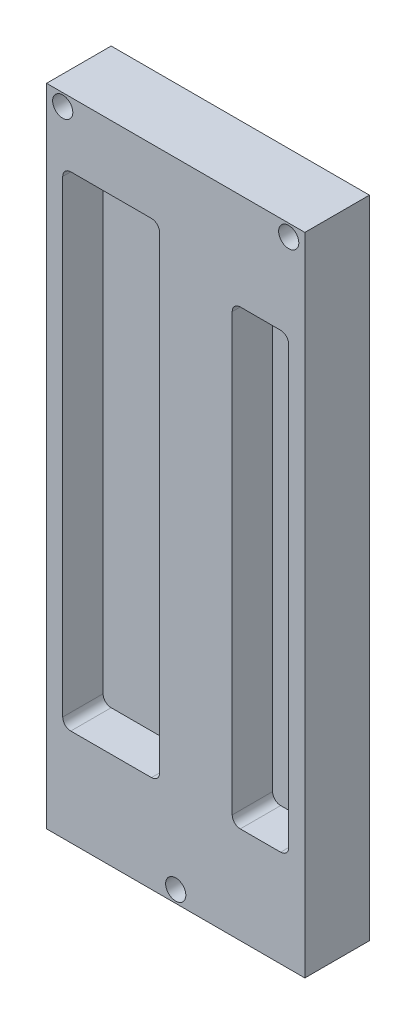
ISO-10303-21;
HEADER;
FILE_DESCRIPTION(('STEP AP214'),'2;1');
FILE_NAME('part.step','',(''),(''),'','','');
FILE_SCHEMA(('AUTOMOTIVE_DESIGN { 1 0 10303 214 1 1 1 1 }'));
ENDSEC;
DATA;
#1=APPLICATION_CONTEXT('core data for automotive mechanical design processes');
#2=APPLICATION_PROTOCOL_DEFINITION('international standard','automotive_design',2000,#1);
#3=PRODUCT_CONTEXT('',#1,'mechanical');
#4=PRODUCT('Part','Part','',(#3));
#5=PRODUCT_RELATED_PRODUCT_CATEGORY('part','',(#4));
#6=PRODUCT_DEFINITION_FORMATION('','',#4);
#7=PRODUCT_DEFINITION_CONTEXT('part definition',#1,'design');
#8=PRODUCT_DEFINITION('design','',#6,#7);
#9=PRODUCT_DEFINITION_SHAPE('','',#8);
#10=(LENGTH_UNIT() NAMED_UNIT(*) SI_UNIT(.MILLI.,.METRE.));
#11=(NAMED_UNIT(*) PLANE_ANGLE_UNIT() SI_UNIT($,.RADIAN.));
#12=(NAMED_UNIT(*) SI_UNIT($,.STERADIAN.) SOLID_ANGLE_UNIT());
#13=UNCERTAINTY_MEASURE_WITH_UNIT(LENGTH_MEASURE(1.E-05),#10,'distance_accuracy_value','');
#14=(GEOMETRIC_REPRESENTATION_CONTEXT(3) GLOBAL_UNCERTAINTY_ASSIGNED_CONTEXT((#13)) GLOBAL_UNIT_ASSIGNED_CONTEXT((#10,
#11,#12)) REPRESENTATION_CONTEXT('',''));
#15=CARTESIAN_POINT('',(0.,0.,0.));
#16=DIRECTION('',(0.,0.,1.));
#17=DIRECTION('',(1.,0.,0.));
#18=AXIS2_PLACEMENT_3D('',#15,#16,#17);
#19=CARTESIAN_POINT('',(0.,0.,8.));
#20=DIRECTION('',(0.,0.,-1.));
#21=DIRECTION('',(-1.,0.,0.));
#22=AXIS2_PLACEMENT_3D('',#19,#20,#21);
#23=PLANE('',#22);
#24=DIRECTION('',(1.,0.,0.));
#25=VECTOR('',#24,1.);
#26=CARTESIAN_POINT('',(3.00000000000001,12.,8.));
#27=LINE('',#26,#25);
#28=CARTESIAN_POINT('',(3.00000000000001,12.,8.));
#29=VERTEX_POINT('',#28);
#30=CARTESIAN_POINT('',(13.,12.,8.));
#31=VERTEX_POINT('',#30);
#32=EDGE_CURVE('E229',#29,#31,#27,.T.);
#33=ORIENTED_EDGE('',*,*,#32,.F.);
#34=CARTESIAN_POINT('',(3.00000000000001,13.,8.));
#35=DIRECTION('',(0.,0.,1.));
#36=DIRECTION('',(1.,0.,0.));
#37=AXIS2_PLACEMENT_3D('',#34,#35,#36);
#38=CIRCLE('',#37,1.);
#39=CARTESIAN_POINT('',(2.00000000000001,13.,8.));
#40=VERTEX_POINT('',#39);
#41=EDGE_CURVE('E55',#40,#29,#38,.T.);
#42=ORIENTED_EDGE('',*,*,#41,.F.);
#43=DIRECTION('',(0.,-1.,0.));
#44=VECTOR('',#43,1.);
#45=CARTESIAN_POINT('',(2.,71.,8.));
#46=LINE('',#45,#44);
#47=CARTESIAN_POINT('',(2.,71.,8.));
#48=VERTEX_POINT('',#47);
#49=EDGE_CURVE('E201',#48,#40,#46,.T.);
#50=ORIENTED_EDGE('',*,*,#49,.F.);
#51=CARTESIAN_POINT('',(3.,71.,8.));
#52=DIRECTION('',(0.,0.,1.));
#53=DIRECTION('',(1.,0.,0.));
#54=AXIS2_PLACEMENT_3D('',#51,#52,#53);
#55=CIRCLE('',#54,1.);
#56=CARTESIAN_POINT('',(3.,72.,8.));
#57=VERTEX_POINT('',#56);
#58=EDGE_CURVE('E205',#57,#48,#55,.T.);
#59=ORIENTED_EDGE('',*,*,#58,.F.);
#60=DIRECTION('',(-1.,0.,0.));
#61=VECTOR('',#60,1.);
#62=CARTESIAN_POINT('',(3.,72.,8.));
#63=LINE('',#62,#61);
#64=CARTESIAN_POINT('',(13.,72.,8.));
#65=VERTEX_POINT('',#64);
#66=EDGE_CURVE('E245',#65,#57,#63,.T.);
#67=ORIENTED_EDGE('',*,*,#66,.F.);
#68=CARTESIAN_POINT('',(13.,71.,8.));
#69=DIRECTION('',(0.,0.,1.));
#70=DIRECTION('',(-1.,0.,0.));
#71=AXIS2_PLACEMENT_3D('',#68,#69,#70);
#72=CIRCLE('',#71,1.);
#73=CARTESIAN_POINT('',(14.,71.,8.));
#74=VERTEX_POINT('',#73);
#75=EDGE_CURVE('E241',#74,#65,#72,.T.);
#76=ORIENTED_EDGE('',*,*,#75,.F.);
#77=DIRECTION('',(0.,1.,0.));
#78=VECTOR('',#77,1.);
#79=CARTESIAN_POINT('',(14.,71.,8.));
#80=LINE('',#79,#78);
#81=CARTESIAN_POINT('',(14.,13.,8.));
#82=VERTEX_POINT('',#81);
#83=EDGE_CURVE('E237',#82,#74,#80,.T.);
#84=ORIENTED_EDGE('',*,*,#83,.F.);
#85=CARTESIAN_POINT('',(13.,13.,8.));
#86=DIRECTION('',(0.,0.,1.));
#87=DIRECTION('',(1.,0.,0.));
#88=AXIS2_PLACEMENT_3D('',#85,#86,#87);
#89=CIRCLE('',#88,1.);
#90=EDGE_CURVE('E233',#31,#82,#89,.T.);
#91=ORIENTED_EDGE('',*,*,#90,.F.);
#92=EDGE_LOOP('',(#33,#42,#50,#59,#67,#76,#84,#91));
#93=FACE_BOUND('',#92,.T.);
#94=DIRECTION('',(1.,0.,0.));
#95=VECTOR('',#94,1.);
#96=CARTESIAN_POINT('',(24.,12.,8.));
#97=LINE('',#96,#95);
#98=CARTESIAN_POINT('',(24.,12.,8.));
#99=VERTEX_POINT('',#98);
#100=CARTESIAN_POINT('',(29.,12.,8.));
#101=VERTEX_POINT('',#100);
#102=EDGE_CURVE('E309',#99,#101,#97,.T.);
#103=ORIENTED_EDGE('',*,*,#102,.F.);
#104=CARTESIAN_POINT('',(24.,13.,8.));
#105=DIRECTION('',(0.,0.,1.));
#106=DIRECTION('',(1.,0.,0.));
#107=AXIS2_PLACEMENT_3D('',#104,#105,#106);
#108=CIRCLE('',#107,1.);
#109=CARTESIAN_POINT('',(23.,13.,8.));
#110=VERTEX_POINT('',#109);
#111=EDGE_CURVE('E63',#110,#99,#108,.T.);
#112=ORIENTED_EDGE('',*,*,#111,.F.);
#113=DIRECTION('',(0.,-1.,0.));
#114=VECTOR('',#113,1.);
#115=CARTESIAN_POINT('',(23.,67.,8.));
#116=LINE('',#115,#114);
#117=CARTESIAN_POINT('',(23.,67.,8.));
#118=VERTEX_POINT('',#117);
#119=EDGE_CURVE('E278',#118,#110,#116,.T.);
#120=ORIENTED_EDGE('',*,*,#119,.F.);
#121=CARTESIAN_POINT('',(24.,67.,8.));
#122=DIRECTION('',(0.,0.,1.));
#123=DIRECTION('',(1.,0.,0.));
#124=AXIS2_PLACEMENT_3D('',#121,#122,#123);
#125=CIRCLE('',#124,1.00000000000001);
#126=CARTESIAN_POINT('',(24.,68.,8.));
#127=VERTEX_POINT('',#126);
#128=EDGE_CURVE('E329',#127,#118,#125,.T.);
#129=ORIENTED_EDGE('',*,*,#128,.F.);
#130=DIRECTION('',(-1.,0.,0.));
#131=VECTOR('',#130,1.);
#132=CARTESIAN_POINT('',(24.,68.,8.));
#133=LINE('',#132,#131);
#134=CARTESIAN_POINT('',(29.,68.,8.));
#135=VERTEX_POINT('',#134);
#136=EDGE_CURVE('E325',#135,#127,#133,.T.);
#137=ORIENTED_EDGE('',*,*,#136,.F.);
#138=CARTESIAN_POINT('',(29.,67.,8.));
#139=DIRECTION('',(0.,0.,1.));
#140=DIRECTION('',(-1.,0.,0.));
#141=AXIS2_PLACEMENT_3D('',#138,#139,#140);
#142=CIRCLE('',#141,1.00000000000001);
#143=CARTESIAN_POINT('',(30.,67.,8.));
#144=VERTEX_POINT('',#143);
#145=EDGE_CURVE('E321',#144,#135,#142,.T.);
#146=ORIENTED_EDGE('',*,*,#145,.F.);
#147=DIRECTION('',(0.,1.,0.));
#148=VECTOR('',#147,1.);
#149=CARTESIAN_POINT('',(30.,67.,8.));
#150=LINE('',#149,#148);
#151=CARTESIAN_POINT('',(30.,13.,8.));
#152=VERTEX_POINT('',#151);
#153=EDGE_CURVE('E317',#152,#144,#150,.T.);
#154=ORIENTED_EDGE('',*,*,#153,.F.);
#155=CARTESIAN_POINT('',(29.,13.,8.));
#156=DIRECTION('',(0.,0.,1.));
#157=DIRECTION('',(1.,0.,0.));
#158=AXIS2_PLACEMENT_3D('',#155,#156,#157);
#159=CIRCLE('',#158,1.);
#160=EDGE_CURVE('E313',#101,#152,#159,.T.);
#161=ORIENTED_EDGE('',*,*,#160,.F.);
#162=EDGE_LOOP('',(#103,#112,#120,#129,#137,#146,#154,#161));
#163=FACE_BOUND('',#162,.T.);
#164=DIRECTION('',(0.,-1.,0.));
#165=VECTOR('',#164,1.);
#166=CARTESIAN_POINT('',(0.,0.,8.));
#167=LINE('',#166,#165);
#168=CARTESIAN_POINT('',(0.,80.,8.));
#169=VERTEX_POINT('',#168);
#170=CARTESIAN_POINT('',(0.,0.,8.));
#171=VERTEX_POINT('',#170);
#172=EDGE_CURVE('E382',#169,#171,#167,.T.);
#173=ORIENTED_EDGE('',*,*,#172,.T.);
#174=DIRECTION('',(1.,0.,0.));
#175=VECTOR('',#174,1.);
#176=CARTESIAN_POINT('',(0.,0.,8.));
#177=LINE('',#176,#175);
#178=CARTESIAN_POINT('',(32.,0.,8.));
#179=VERTEX_POINT('',#178);
#180=EDGE_CURVE('E386',#171,#179,#177,.T.);
#181=ORIENTED_EDGE('',*,*,#180,.T.);
#182=DIRECTION('',(0.,1.,0.));
#183=VECTOR('',#182,1.);
#184=CARTESIAN_POINT('',(32.,0.,8.));
#185=LINE('',#184,#183);
#186=CARTESIAN_POINT('',(32.,80.,8.));
#187=VERTEX_POINT('',#186);
#188=EDGE_CURVE('E390',#179,#187,#185,.T.);
#189=ORIENTED_EDGE('',*,*,#188,.T.);
#190=DIRECTION('',(-1.,0.,0.));
#191=VECTOR('',#190,1.);
#192=CARTESIAN_POINT('',(0.,80.,8.));
#193=LINE('',#192,#191);
#194=EDGE_CURVE('E393',#187,#169,#193,.T.);
#195=ORIENTED_EDGE('',*,*,#194,.T.);
#196=EDGE_LOOP('',(#173,#181,#189,#195));
#197=FACE_BOUND('',#196,.T.);
#198=CARTESIAN_POINT('',(2.,78.5,8.));
#199=DIRECTION('',(0.,0.,1.));
#200=DIRECTION('',(1.,0.,0.));
#201=AXIS2_PLACEMENT_3D('',#198,#199,#200);
#202=CIRCLE('',#201,1.25);
#203=CARTESIAN_POINT('',(3.25,78.5,8.));
#204=VERTEX_POINT('',#203);
#205=EDGE_CURVE('E374',#204,#204,#202,.T.);
#206=ORIENTED_EDGE('',*,*,#205,.F.);
#207=EDGE_LOOP('',(#206));
#208=FACE_BOUND('',#207,.T.);
#209=CARTESIAN_POINT('',(30.,78.5,8.));
#210=DIRECTION('',(0.,0.,1.));
#211=DIRECTION('',(1.,0.,0.));
#212=AXIS2_PLACEMENT_3D('',#209,#210,#211);
#213=CIRCLE('',#212,1.25);
#214=CARTESIAN_POINT('',(31.25,78.5,8.));
#215=VERTEX_POINT('',#214);
#216=EDGE_CURVE('E366',#215,#215,#213,.T.);
#217=ORIENTED_EDGE('',*,*,#216,.F.);
#218=EDGE_LOOP('',(#217));
#219=FACE_BOUND('',#218,.T.);
#220=CARTESIAN_POINT('',(16.,1.5,8.));
#221=DIRECTION('',(0.,0.,1.));
#222=DIRECTION('',(1.,0.,0.));
#223=AXIS2_PLACEMENT_3D('',#220,#221,#222);
#224=CIRCLE('',#223,1.25);
#225=CARTESIAN_POINT('',(17.25,1.5,8.));
#226=VERTEX_POINT('',#225);
#227=EDGE_CURVE('E358',#226,#226,#224,.T.);
#228=ORIENTED_EDGE('',*,*,#227,.F.);
#229=EDGE_LOOP('',(#228));
#230=FACE_BOUND('',#229,.T.);
#231=ADVANCED_FACE('F39',(#93,#163,#197,#208,#219,#230),#23,.F.);
#232=CARTESIAN_POINT('',(0.,0.,0.));
#233=DIRECTION('',(0.,0.,-1.));
#234=DIRECTION('',(-1.,0.,0.));
#235=AXIS2_PLACEMENT_3D('',#232,#233,#234);
#236=PLANE('',#235);
#237=CARTESIAN_POINT('',(30.,78.5,0.));
#238=DIRECTION('',(0.,0.,1.));
#239=DIRECTION('',(1.,0.,0.));
#240=AXIS2_PLACEMENT_3D('',#237,#238,#239);
#241=CIRCLE('',#240,1.25);
#242=CARTESIAN_POINT('',(31.25,78.5,0.));
#243=VERTEX_POINT('',#242);
#244=EDGE_CURVE('E362',#243,#243,#241,.T.);
#245=ORIENTED_EDGE('',*,*,#244,.T.);
#246=EDGE_LOOP('',(#245));
#247=FACE_BOUND('',#246,.T.);
#248=DIRECTION('',(0.,-1.,0.));
#249=VECTOR('',#248,1.);
#250=CARTESIAN_POINT('',(0.,0.,0.));
#251=LINE('',#250,#249);
#252=CARTESIAN_POINT('',(0.,80.,0.));
#253=VERTEX_POINT('',#252);
#254=CARTESIAN_POINT('',(0.,0.,0.));
#255=VERTEX_POINT('',#254);
#256=EDGE_CURVE('E378',#253,#255,#251,.T.);
#257=ORIENTED_EDGE('',*,*,#256,.F.);
#258=DIRECTION('',(-1.,0.,0.));
#259=VECTOR('',#258,1.);
#260=CARTESIAN_POINT('',(0.,80.,0.));
#261=LINE('',#260,#259);
#262=CARTESIAN_POINT('',(32.,80.,0.));
#263=VERTEX_POINT('',#262);
#264=EDGE_CURVE('E387',#263,#253,#261,.T.);
#265=ORIENTED_EDGE('',*,*,#264,.F.);
#266=DIRECTION('',(0.,1.,0.));
#267=VECTOR('',#266,1.);
#268=CARTESIAN_POINT('',(32.,0.,0.));
#269=LINE('',#268,#267);
#270=CARTESIAN_POINT('',(32.,0.,0.));
#271=VERTEX_POINT('',#270);
#272=EDGE_CURVE('E403',#271,#263,#269,.T.);
#273=ORIENTED_EDGE('',*,*,#272,.F.);
#274=DIRECTION('',(1.,0.,0.));
#275=VECTOR('',#274,1.);
#276=CARTESIAN_POINT('',(0.,0.,0.));
#277=LINE('',#276,#275);
#278=EDGE_CURVE('E400',#255,#271,#277,.T.);
#279=ORIENTED_EDGE('',*,*,#278,.F.);
#280=EDGE_LOOP('',(#257,#265,#273,#279));
#281=FACE_BOUND('',#280,.T.);
#282=CARTESIAN_POINT('',(2.,78.5,0.));
#283=DIRECTION('',(0.,0.,1.));
#284=DIRECTION('',(1.,0.,0.));
#285=AXIS2_PLACEMENT_3D('',#282,#283,#284);
#286=CIRCLE('',#285,1.25);
#287=CARTESIAN_POINT('',(3.25,78.5,0.));
#288=VERTEX_POINT('',#287);
#289=EDGE_CURVE('E370',#288,#288,#286,.T.);
#290=ORIENTED_EDGE('',*,*,#289,.T.);
#291=EDGE_LOOP('',(#290));
#292=FACE_BOUND('',#291,.T.);
#293=CARTESIAN_POINT('',(16.,1.5,0.));
#294=DIRECTION('',(0.,0.,1.));
#295=DIRECTION('',(1.,0.,0.));
#296=AXIS2_PLACEMENT_3D('',#293,#294,#295);
#297=CIRCLE('',#296,1.25);
#298=CARTESIAN_POINT('',(17.25,1.5,0.));
#299=VERTEX_POINT('',#298);
#300=EDGE_CURVE('E255',#299,#299,#297,.T.);
#301=ORIENTED_EDGE('',*,*,#300,.T.);
#302=EDGE_LOOP('',(#301));
#303=FACE_BOUND('',#302,.T.);
#304=ADVANCED_FACE('F426',(#247,#281,#292,#303),#236,.T.);
#305=CARTESIAN_POINT('',(0.,0.,8.));
#306=DIRECTION('',(1.,0.,0.));
#307=DIRECTION('',(0.,0.,-1.));
#308=AXIS2_PLACEMENT_3D('',#305,#306,#307);
#309=PLANE('',#308);
#310=ORIENTED_EDGE('',*,*,#256,.T.);
#311=DIRECTION('',(0.,0.,-1.));
#312=VECTOR('',#311,1.);
#313=CARTESIAN_POINT('',(0.,0.,8.));
#314=LINE('',#313,#312);
#315=EDGE_CURVE('E11',#171,#255,#314,.T.);
#316=ORIENTED_EDGE('',*,*,#315,.F.);
#317=ORIENTED_EDGE('',*,*,#172,.F.);
#318=DIRECTION('',(0.,0.,-1.));
#319=VECTOR('',#318,1.);
#320=CARTESIAN_POINT('',(0.,80.,8.));
#321=LINE('',#320,#319);
#322=EDGE_CURVE('E396',#169,#253,#321,.T.);
#323=ORIENTED_EDGE('',*,*,#322,.T.);
#324=EDGE_LOOP('',(#310,#316,#317,#323));
#325=FACE_BOUND('',#324,.T.);
#326=ADVANCED_FACE('F41',(#325),#309,.F.);
#327=CARTESIAN_POINT('',(0.,0.,8.));
#328=DIRECTION('',(0.,1.,0.));
#329=DIRECTION('',(0.,0.,1.));
#330=AXIS2_PLACEMENT_3D('',#327,#328,#329);
#331=PLANE('',#330);
#332=ORIENTED_EDGE('',*,*,#278,.T.);
#333=DIRECTION('',(0.,0.,-1.));
#334=VECTOR('',#333,1.);
#335=CARTESIAN_POINT('',(32.,0.,8.));
#336=LINE('',#335,#334);
#337=EDGE_CURVE('E48',#179,#271,#336,.T.);
#338=ORIENTED_EDGE('',*,*,#337,.F.);
#339=ORIENTED_EDGE('',*,*,#180,.F.);
#340=ORIENTED_EDGE('',*,*,#315,.T.);
#341=EDGE_LOOP('',(#332,#338,#339,#340));
#342=FACE_BOUND('',#341,.T.);
#343=ADVANCED_FACE('F437',(#342),#331,.F.);
#344=CARTESIAN_POINT('',(32.,0.,8.));
#345=DIRECTION('',(-1.,0.,0.));
#346=DIRECTION('',(0.,0.,1.));
#347=AXIS2_PLACEMENT_3D('',#344,#345,#346);
#348=PLANE('',#347);
#349=ORIENTED_EDGE('',*,*,#272,.T.);
#350=DIRECTION('',(0.,0.,-1.));
#351=VECTOR('',#350,1.);
#352=CARTESIAN_POINT('',(32.,80.,8.));
#353=LINE('',#352,#351);
#354=EDGE_CURVE('E411',#187,#263,#353,.T.);
#355=ORIENTED_EDGE('',*,*,#354,.F.);
#356=ORIENTED_EDGE('',*,*,#188,.F.);
#357=ORIENTED_EDGE('',*,*,#337,.T.);
#358=EDGE_LOOP('',(#349,#355,#356,#357));
#359=FACE_BOUND('',#358,.T.);
#360=ADVANCED_FACE('F420',(#359),#348,.F.);
#361=CARTESIAN_POINT('',(0.,80.,8.));
#362=DIRECTION('',(0.,-1.,0.));
#363=DIRECTION('',(0.,0.,-1.));
#364=AXIS2_PLACEMENT_3D('',#361,#362,#363);
#365=PLANE('',#364);
#366=ORIENTED_EDGE('',*,*,#264,.T.);
#367=ORIENTED_EDGE('',*,*,#322,.F.);
#368=ORIENTED_EDGE('',*,*,#194,.F.);
#369=ORIENTED_EDGE('',*,*,#354,.T.);
#370=EDGE_LOOP('',(#366,#367,#368,#369));
#371=FACE_BOUND('',#370,.T.);
#372=ADVANCED_FACE('F430',(#371),#365,.F.);
#373=CARTESIAN_POINT('',(2.,78.5,8.));
#374=DIRECTION('',(0.,0.,-1.));
#375=DIRECTION('',(-1.,0.,0.));
#376=AXIS2_PLACEMENT_3D('',#373,#374,#375);
#377=CYLINDRICAL_SURFACE('',#376,1.25);
#378=ORIENTED_EDGE('',*,*,#205,.T.);
#379=EDGE_LOOP('',(#378));
#380=FACE_BOUND('',#379,.T.);
#381=ORIENTED_EDGE('',*,*,#289,.F.);
#382=EDGE_LOOP('',(#381));
#383=FACE_BOUND('',#382,.T.);
#384=ADVANCED_FACE('F454',(#380,#383),#377,.F.);
#385=CARTESIAN_POINT('',(30.,78.5,8.));
#386=DIRECTION('',(0.,0.,-1.));
#387=DIRECTION('',(-1.,0.,0.));
#388=AXIS2_PLACEMENT_3D('',#385,#386,#387);
#389=CYLINDRICAL_SURFACE('',#388,1.25);
#390=ORIENTED_EDGE('',*,*,#216,.T.);
#391=EDGE_LOOP('',(#390));
#392=FACE_BOUND('',#391,.T.);
#393=ORIENTED_EDGE('',*,*,#244,.F.);
#394=EDGE_LOOP('',(#393));
#395=FACE_BOUND('',#394,.T.);
#396=ADVANCED_FACE('F461',(#392,#395),#389,.F.);
#397=CARTESIAN_POINT('',(16.,1.5,8.));
#398=DIRECTION('',(0.,0.,-1.));
#399=DIRECTION('',(-1.,0.,0.));
#400=AXIS2_PLACEMENT_3D('',#397,#398,#399);
#401=CYLINDRICAL_SURFACE('',#400,1.25);
#402=ORIENTED_EDGE('',*,*,#227,.T.);
#403=EDGE_LOOP('',(#402));
#404=FACE_BOUND('',#403,.T.);
#405=ORIENTED_EDGE('',*,*,#300,.F.);
#406=EDGE_LOOP('',(#405));
#407=FACE_BOUND('',#406,.T.);
#408=ADVANCED_FACE('F466',(#404,#407),#401,.F.);
#409=CARTESIAN_POINT('',(24.,13.,3.));
#410=DIRECTION('',(0.,0.,1.));
#411=DIRECTION('',(1.,0.,0.));
#412=AXIS2_PLACEMENT_3D('',#409,#410,#411);
#413=CYLINDRICAL_SURFACE('',#412,1.);
#414=ORIENTED_EDGE('',*,*,#111,.T.);
#415=DIRECTION('',(0.,0.,1.));
#416=VECTOR('',#415,1.);
#417=CARTESIAN_POINT('',(24.,12.,3.));
#418=LINE('',#417,#416);
#419=CARTESIAN_POINT('',(24.,12.,3.));
#420=VERTEX_POINT('',#419);
#421=EDGE_CURVE('E306',#420,#99,#418,.T.);
#422=ORIENTED_EDGE('',*,*,#421,.F.);
#423=CARTESIAN_POINT('',(24.,13.,3.));
#424=DIRECTION('',(0.,0.,1.));
#425=DIRECTION('',(1.,0.,0.));
#426=AXIS2_PLACEMENT_3D('',#423,#424,#425);
#427=CIRCLE('',#426,1.);
#428=CARTESIAN_POINT('',(23.,13.,3.));
#429=VERTEX_POINT('',#428);
#430=EDGE_CURVE('E273',#429,#420,#427,.T.);
#431=ORIENTED_EDGE('',*,*,#430,.F.);
#432=DIRECTION('',(0.,0.,1.));
#433=VECTOR('',#432,1.);
#434=CARTESIAN_POINT('',(23.,13.,3.));
#435=LINE('',#434,#433);
#436=EDGE_CURVE('E230',#429,#110,#435,.T.);
#437=ORIENTED_EDGE('',*,*,#436,.T.);
#438=EDGE_LOOP('',(#414,#422,#431,#437));
#439=FACE_BOUND('',#438,.T.);
#440=ADVANCED_FACE('F475',(#439),#413,.F.);
#441=CARTESIAN_POINT('',(23.,67.,3.));
#442=DIRECTION('',(-1.,0.,0.));
#443=DIRECTION('',(0.,-1.,0.));
#444=AXIS2_PLACEMENT_3D('',#441,#442,#443);
#445=PLANE('',#444);
#446=ORIENTED_EDGE('',*,*,#119,.T.);
#447=ORIENTED_EDGE('',*,*,#436,.F.);
#448=DIRECTION('',(0.,-1.,0.));
#449=VECTOR('',#448,1.);
#450=CARTESIAN_POINT('',(23.,67.,3.));
#451=LINE('',#450,#449);
#452=CARTESIAN_POINT('',(23.,67.,3.));
#453=VERTEX_POINT('',#452);
#454=EDGE_CURVE('E302',#453,#429,#451,.T.);
#455=ORIENTED_EDGE('',*,*,#454,.F.);
#456=DIRECTION('',(0.,0.,1.));
#457=VECTOR('',#456,1.);
#458=CARTESIAN_POINT('',(23.,67.,3.));
#459=LINE('',#458,#457);
#460=EDGE_CURVE('E338',#453,#118,#459,.T.);
#461=ORIENTED_EDGE('',*,*,#460,.T.);
#462=EDGE_LOOP('',(#446,#447,#455,#461));
#463=FACE_BOUND('',#462,.T.);
#464=ADVANCED_FACE('F481',(#463),#445,.F.);
#465=CARTESIAN_POINT('',(24.,67.,3.));
#466=DIRECTION('',(0.,0.,1.));
#467=DIRECTION('',(1.,0.,0.));
#468=AXIS2_PLACEMENT_3D('',#465,#466,#467);
#469=CYLINDRICAL_SURFACE('',#468,1.00000000000001);
#470=ORIENTED_EDGE('',*,*,#128,.T.);
#471=ORIENTED_EDGE('',*,*,#460,.F.);
#472=CARTESIAN_POINT('',(24.,67.,3.));
#473=DIRECTION('',(0.,0.,1.));
#474=DIRECTION('',(1.,0.,0.));
#475=AXIS2_PLACEMENT_3D('',#472,#473,#474);
#476=CIRCLE('',#475,1.00000000000001);
#477=CARTESIAN_POINT('',(24.,68.,3.));
#478=VERTEX_POINT('',#477);
#479=EDGE_CURVE('E298',#478,#453,#476,.T.);
#480=ORIENTED_EDGE('',*,*,#479,.F.);
#481=DIRECTION('',(0.,0.,1.));
#482=VECTOR('',#481,1.);
#483=CARTESIAN_POINT('',(24.,68.,3.));
#484=LINE('',#483,#482);
#485=EDGE_CURVE('E341',#478,#127,#484,.T.);
#486=ORIENTED_EDGE('',*,*,#485,.T.);
#487=EDGE_LOOP('',(#470,#471,#480,#486));
#488=FACE_BOUND('',#487,.T.);
#489=ADVANCED_FACE('F504',(#488),#469,.F.);
#490=CARTESIAN_POINT('',(24.,68.,3.));
#491=DIRECTION('',(0.,1.,0.));
#492=DIRECTION('',(0.,0.,1.));
#493=AXIS2_PLACEMENT_3D('',#490,#491,#492);
#494=PLANE('',#493);
#495=ORIENTED_EDGE('',*,*,#136,.T.);
#496=ORIENTED_EDGE('',*,*,#485,.F.);
#497=DIRECTION('',(-1.,0.,0.));
#498=VECTOR('',#497,1.);
#499=CARTESIAN_POINT('',(24.,68.,3.));
#500=LINE('',#499,#498);
#501=CARTESIAN_POINT('',(29.,68.,3.));
#502=VERTEX_POINT('',#501);
#503=EDGE_CURVE('E294',#502,#478,#500,.T.);
#504=ORIENTED_EDGE('',*,*,#503,.F.);
#505=DIRECTION('',(0.,0.,1.));
#506=VECTOR('',#505,1.);
#507=CARTESIAN_POINT('',(29.,68.,3.));
#508=LINE('',#507,#506);
#509=EDGE_CURVE('E344',#502,#135,#508,.T.);
#510=ORIENTED_EDGE('',*,*,#509,.T.);
#511=EDGE_LOOP('',(#495,#496,#504,#510));
#512=FACE_BOUND('',#511,.T.);
#513=ADVANCED_FACE('F500',(#512),#494,.F.);
#514=CARTESIAN_POINT('',(29.,67.,3.));
#515=DIRECTION('',(0.,0.,1.));
#516=DIRECTION('',(1.,0.,0.));
#517=AXIS2_PLACEMENT_3D('',#514,#515,#516);
#518=CYLINDRICAL_SURFACE('',#517,1.00000000000001);
#519=ORIENTED_EDGE('',*,*,#145,.T.);
#520=ORIENTED_EDGE('',*,*,#509,.F.);
#521=CARTESIAN_POINT('',(29.,67.,3.));
#522=DIRECTION('',(0.,0.,1.));
#523=DIRECTION('',(-1.,0.,0.));
#524=AXIS2_PLACEMENT_3D('',#521,#522,#523);
#525=CIRCLE('',#524,1.00000000000001);
#526=CARTESIAN_POINT('',(30.,67.,3.));
#527=VERTEX_POINT('',#526);
#528=EDGE_CURVE('E290',#527,#502,#525,.T.);
#529=ORIENTED_EDGE('',*,*,#528,.F.);
#530=DIRECTION('',(0.,0.,1.));
#531=VECTOR('',#530,1.);
#532=CARTESIAN_POINT('',(30.,67.,3.));
#533=LINE('',#532,#531);
#534=EDGE_CURVE('E347',#527,#144,#533,.T.);
#535=ORIENTED_EDGE('',*,*,#534,.T.);
#536=EDGE_LOOP('',(#519,#520,#529,#535));
#537=FACE_BOUND('',#536,.T.);
#538=ADVANCED_FACE('F496',(#537),#518,.F.);
#539=CARTESIAN_POINT('',(30.,67.,3.));
#540=DIRECTION('',(1.,0.,0.));
#541=DIRECTION('',(0.,1.,0.));
#542=AXIS2_PLACEMENT_3D('',#539,#540,#541);
#543=PLANE('',#542);
#544=ORIENTED_EDGE('',*,*,#153,.T.);
#545=ORIENTED_EDGE('',*,*,#534,.F.);
#546=DIRECTION('',(0.,1.,0.));
#547=VECTOR('',#546,1.);
#548=CARTESIAN_POINT('',(30.,67.,3.));
#549=LINE('',#548,#547);
#550=CARTESIAN_POINT('',(30.,13.,3.));
#551=VERTEX_POINT('',#550);
#552=EDGE_CURVE('E286',#551,#527,#549,.T.);
#553=ORIENTED_EDGE('',*,*,#552,.F.);
#554=DIRECTION('',(0.,0.,1.));
#555=VECTOR('',#554,1.);
#556=CARTESIAN_POINT('',(30.,13.,3.));
#557=LINE('',#556,#555);
#558=EDGE_CURVE('E350',#551,#152,#557,.T.);
#559=ORIENTED_EDGE('',*,*,#558,.T.);
#560=EDGE_LOOP('',(#544,#545,#553,#559));
#561=FACE_BOUND('',#560,.T.);
#562=ADVANCED_FACE('F492',(#561),#543,.F.);
#563=CARTESIAN_POINT('',(29.,13.,3.));
#564=DIRECTION('',(0.,0.,1.));
#565=DIRECTION('',(1.,0.,0.));
#566=AXIS2_PLACEMENT_3D('',#563,#564,#565);
#567=CYLINDRICAL_SURFACE('',#566,1.);
#568=ORIENTED_EDGE('',*,*,#160,.T.);
#569=ORIENTED_EDGE('',*,*,#558,.F.);
#570=CARTESIAN_POINT('',(29.,13.,3.));
#571=DIRECTION('',(0.,0.,1.));
#572=DIRECTION('',(1.,0.,0.));
#573=AXIS2_PLACEMENT_3D('',#570,#571,#572);
#574=CIRCLE('',#573,1.);
#575=CARTESIAN_POINT('',(29.,12.,3.));
#576=VERTEX_POINT('',#575);
#577=EDGE_CURVE('E282',#576,#551,#574,.T.);
#578=ORIENTED_EDGE('',*,*,#577,.F.);
#579=DIRECTION('',(0.,0.,1.));
#580=VECTOR('',#579,1.);
#581=CARTESIAN_POINT('',(29.,12.,3.));
#582=LINE('',#581,#580);
#583=EDGE_CURVE('E353',#576,#101,#582,.T.);
#584=ORIENTED_EDGE('',*,*,#583,.T.);
#585=EDGE_LOOP('',(#568,#569,#578,#584));
#586=FACE_BOUND('',#585,.T.);
#587=ADVANCED_FACE('F488',(#586),#567,.F.);
#588=CARTESIAN_POINT('',(24.,12.,3.));
#589=DIRECTION('',(0.,-1.,0.));
#590=DIRECTION('',(1.,0.,0.));
#591=AXIS2_PLACEMENT_3D('',#588,#589,#590);
#592=PLANE('',#591);
#593=ORIENTED_EDGE('',*,*,#102,.T.);
#594=ORIENTED_EDGE('',*,*,#583,.F.);
#595=DIRECTION('',(1.,0.,0.));
#596=VECTOR('',#595,1.);
#597=CARTESIAN_POINT('',(24.,12.,3.));
#598=LINE('',#597,#596);
#599=EDGE_CURVE('E277',#420,#576,#598,.T.);
#600=ORIENTED_EDGE('',*,*,#599,.F.);
#601=ORIENTED_EDGE('',*,*,#421,.T.);
#602=EDGE_LOOP('',(#593,#594,#600,#601));
#603=FACE_BOUND('',#602,.T.);
#604=ADVANCED_FACE('F484',(#603),#592,.F.);
#605=CARTESIAN_POINT('',(24.,13.,3.));
#606=DIRECTION('',(0.,0.,1.));
#607=DIRECTION('',(1.,0.,0.));
#608=AXIS2_PLACEMENT_3D('',#605,#606,#607);
#609=PLANE('',#608);
#610=ORIENTED_EDGE('',*,*,#430,.T.);
#611=ORIENTED_EDGE('',*,*,#599,.T.);
#612=ORIENTED_EDGE('',*,*,#577,.T.);
#613=ORIENTED_EDGE('',*,*,#552,.T.);
#614=ORIENTED_EDGE('',*,*,#528,.T.);
#615=ORIENTED_EDGE('',*,*,#503,.T.);
#616=ORIENTED_EDGE('',*,*,#479,.T.);
#617=ORIENTED_EDGE('',*,*,#454,.T.);
#618=EDGE_LOOP('',(#610,#611,#612,#613,#614,#615,#616,#617));
#619=FACE_BOUND('',#618,.T.);
#620=ADVANCED_FACE('F487',(#619),#609,.T.);
#621=CARTESIAN_POINT('',(3.00000000000001,13.,3.));
#622=DIRECTION('',(0.,0.,1.));
#623=DIRECTION('',(1.,0.,0.));
#624=AXIS2_PLACEMENT_3D('',#621,#622,#623);
#625=CYLINDRICAL_SURFACE('',#624,1.);
#626=ORIENTED_EDGE('',*,*,#41,.T.);
#627=DIRECTION('',(0.,0.,1.));
#628=VECTOR('',#627,1.);
#629=CARTESIAN_POINT('',(3.00000000000001,12.,3.));
#630=LINE('',#629,#628);
#631=CARTESIAN_POINT('',(3.00000000000001,12.,3.));
#632=VERTEX_POINT('',#631);
#633=EDGE_CURVE('E175',#632,#29,#630,.T.);
#634=ORIENTED_EDGE('',*,*,#633,.F.);
#635=CARTESIAN_POINT('',(3.00000000000001,13.,3.));
#636=DIRECTION('',(0.,0.,1.));
#637=DIRECTION('',(1.,0.,0.));
#638=AXIS2_PLACEMENT_3D('',#635,#636,#637);
#639=CIRCLE('',#638,1.);
#640=CARTESIAN_POINT('',(2.00000000000001,13.,3.));
#641=VERTEX_POINT('',#640);
#642=EDGE_CURVE('E179',#641,#632,#639,.T.);
#643=ORIENTED_EDGE('',*,*,#642,.F.);
#644=DIRECTION('',(0.,0.,1.));
#645=VECTOR('',#644,1.);
#646=CARTESIAN_POINT('',(2.00000000000001,13.,3.));
#647=LINE('',#646,#645);
#648=EDGE_CURVE('E252',#641,#40,#647,.T.);
#649=ORIENTED_EDGE('',*,*,#648,.T.);
#650=EDGE_LOOP('',(#626,#634,#643,#649));
#651=FACE_BOUND('',#650,.T.);
#652=ADVANCED_FACE('F177',(#651),#625,.F.);
#653=CARTESIAN_POINT('',(2.,71.,3.));
#654=DIRECTION('',(-1.,0.,0.));
#655=DIRECTION('',(0.,-1.,0.));
#656=AXIS2_PLACEMENT_3D('',#653,#654,#655);
#657=PLANE('',#656);
#658=ORIENTED_EDGE('',*,*,#49,.T.);
#659=ORIENTED_EDGE('',*,*,#648,.F.);
#660=DIRECTION('',(0.,-1.,0.));
#661=VECTOR('',#660,1.);
#662=CARTESIAN_POINT('',(2.,71.,3.));
#663=LINE('',#662,#661);
#664=CARTESIAN_POINT('',(2.,71.,3.));
#665=VERTEX_POINT('',#664);
#666=EDGE_CURVE('E186',#665,#641,#663,.T.);
#667=ORIENTED_EDGE('',*,*,#666,.F.);
#668=DIRECTION('',(0.,0.,1.));
#669=VECTOR('',#668,1.);
#670=CARTESIAN_POINT('',(2.,71.,3.));
#671=LINE('',#670,#669);
#672=EDGE_CURVE('E256',#665,#48,#671,.T.);
#673=ORIENTED_EDGE('',*,*,#672,.T.);
#674=EDGE_LOOP('',(#658,#659,#667,#673));
#675=FACE_BOUND('',#674,.T.);
#676=ADVANCED_FACE('F517',(#675),#657,.F.);
#677=CARTESIAN_POINT('',(3.,71.,3.));
#678=DIRECTION('',(0.,0.,1.));
#679=DIRECTION('',(1.,0.,0.));
#680=AXIS2_PLACEMENT_3D('',#677,#678,#679);
#681=CYLINDRICAL_SURFACE('',#680,1.);
#682=ORIENTED_EDGE('',*,*,#58,.T.);
#683=ORIENTED_EDGE('',*,*,#672,.F.);
#684=CARTESIAN_POINT('',(3.,71.,3.));
#685=DIRECTION('',(0.,0.,1.));
#686=DIRECTION('',(1.,0.,0.));
#687=AXIS2_PLACEMENT_3D('',#684,#685,#686);
#688=CIRCLE('',#687,1.);
#689=CARTESIAN_POINT('',(3.,72.,3.));
#690=VERTEX_POINT('',#689);
#691=EDGE_CURVE('E222',#690,#665,#688,.T.);
#692=ORIENTED_EDGE('',*,*,#691,.F.);
#693=DIRECTION('',(0.,0.,1.));
#694=VECTOR('',#693,1.);
#695=CARTESIAN_POINT('',(3.,72.,3.));
#696=LINE('',#695,#694);
#697=EDGE_CURVE('E259',#690,#57,#696,.T.);
#698=ORIENTED_EDGE('',*,*,#697,.T.);
#699=EDGE_LOOP('',(#682,#683,#692,#698));
#700=FACE_BOUND('',#699,.T.);
#701=ADVANCED_FACE('F535',(#700),#681,.F.);
#702=CARTESIAN_POINT('',(3.,72.,3.));
#703=DIRECTION('',(0.,1.,0.));
#704=DIRECTION('',(0.,0.,1.));
#705=AXIS2_PLACEMENT_3D('',#702,#703,#704);
#706=PLANE('',#705);
#707=ORIENTED_EDGE('',*,*,#66,.T.);
#708=ORIENTED_EDGE('',*,*,#697,.F.);
#709=DIRECTION('',(-1.,0.,0.));
#710=VECTOR('',#709,1.);
#711=CARTESIAN_POINT('',(3.,72.,3.));
#712=LINE('',#711,#710);
#713=CARTESIAN_POINT('',(13.,72.,3.));
#714=VERTEX_POINT('',#713);
#715=EDGE_CURVE('E218',#714,#690,#712,.T.);
#716=ORIENTED_EDGE('',*,*,#715,.F.);
#717=DIRECTION('',(0.,0.,1.));
#718=VECTOR('',#717,1.);
#719=CARTESIAN_POINT('',(13.,72.,3.));
#720=LINE('',#719,#718);
#721=EDGE_CURVE('E262',#714,#65,#720,.T.);
#722=ORIENTED_EDGE('',*,*,#721,.T.);
#723=EDGE_LOOP('',(#707,#708,#716,#722));
#724=FACE_BOUND('',#723,.T.);
#725=ADVANCED_FACE('F531',(#724),#706,.F.);
#726=CARTESIAN_POINT('',(13.,71.,3.));
#727=DIRECTION('',(0.,0.,1.));
#728=DIRECTION('',(1.,0.,0.));
#729=AXIS2_PLACEMENT_3D('',#726,#727,#728);
#730=CYLINDRICAL_SURFACE('',#729,1.);
#731=ORIENTED_EDGE('',*,*,#75,.T.);
#732=ORIENTED_EDGE('',*,*,#721,.F.);
#733=CARTESIAN_POINT('',(13.,71.,3.));
#734=DIRECTION('',(0.,0.,1.));
#735=DIRECTION('',(-1.,0.,0.));
#736=AXIS2_PLACEMENT_3D('',#733,#734,#735);
#737=CIRCLE('',#736,1.);
#738=CARTESIAN_POINT('',(14.,71.,3.));
#739=VERTEX_POINT('',#738);
#740=EDGE_CURVE('E214',#739,#714,#737,.T.);
#741=ORIENTED_EDGE('',*,*,#740,.F.);
#742=DIRECTION('',(0.,0.,1.));
#743=VECTOR('',#742,1.);
#744=CARTESIAN_POINT('',(14.,71.,3.));
#745=LINE('',#744,#743);
#746=EDGE_CURVE('E265',#739,#74,#745,.T.);
#747=ORIENTED_EDGE('',*,*,#746,.T.);
#748=EDGE_LOOP('',(#731,#732,#741,#747));
#749=FACE_BOUND('',#748,.T.);
#750=ADVANCED_FACE('F527',(#749),#730,.F.);
#751=CARTESIAN_POINT('',(14.,71.,3.));
#752=DIRECTION('',(1.,0.,0.));
#753=DIRECTION('',(0.,1.,0.));
#754=AXIS2_PLACEMENT_3D('',#751,#752,#753);
#755=PLANE('',#754);
#756=ORIENTED_EDGE('',*,*,#83,.T.);
#757=ORIENTED_EDGE('',*,*,#746,.F.);
#758=DIRECTION('',(0.,1.,0.));
#759=VECTOR('',#758,1.);
#760=CARTESIAN_POINT('',(14.,71.,3.));
#761=LINE('',#760,#759);
#762=CARTESIAN_POINT('',(14.,13.,3.));
#763=VERTEX_POINT('',#762);
#764=EDGE_CURVE('E210',#763,#739,#761,.T.);
#765=ORIENTED_EDGE('',*,*,#764,.F.);
#766=DIRECTION('',(0.,0.,1.));
#767=VECTOR('',#766,1.);
#768=CARTESIAN_POINT('',(14.,13.,3.));
#769=LINE('',#768,#767);
#770=EDGE_CURVE('E268',#763,#82,#769,.T.);
#771=ORIENTED_EDGE('',*,*,#770,.T.);
#772=EDGE_LOOP('',(#756,#757,#765,#771));
#773=FACE_BOUND('',#772,.T.);
#774=ADVANCED_FACE('F523',(#773),#755,.F.);
#775=CARTESIAN_POINT('',(13.,13.,3.));
#776=DIRECTION('',(0.,0.,1.));
#777=DIRECTION('',(1.,0.,0.));
#778=AXIS2_PLACEMENT_3D('',#775,#776,#777);
#779=CYLINDRICAL_SURFACE('',#778,1.);
#780=ORIENTED_EDGE('',*,*,#90,.T.);
#781=ORIENTED_EDGE('',*,*,#770,.F.);
#782=CARTESIAN_POINT('',(13.,13.,3.));
#783=DIRECTION('',(0.,0.,1.));
#784=DIRECTION('',(1.,0.,0.));
#785=AXIS2_PLACEMENT_3D('',#782,#783,#784);
#786=CIRCLE('',#785,1.);
#787=CARTESIAN_POINT('',(13.,12.,3.));
#788=VERTEX_POINT('',#787);
#789=EDGE_CURVE('E195',#788,#763,#786,.T.);
#790=ORIENTED_EDGE('',*,*,#789,.F.);
#791=DIRECTION('',(0.,0.,1.));
#792=VECTOR('',#791,1.);
#793=CARTESIAN_POINT('',(13.,12.,3.));
#794=LINE('',#793,#792);
#795=EDGE_CURVE('E185',#788,#31,#794,.T.);
#796=ORIENTED_EDGE('',*,*,#795,.T.);
#797=EDGE_LOOP('',(#780,#781,#790,#796));
#798=FACE_BOUND('',#797,.T.);
#799=ADVANCED_FACE('F520',(#798),#779,.F.);
#800=CARTESIAN_POINT('',(3.00000000000001,12.,3.));
#801=DIRECTION('',(0.,-1.,0.));
#802=DIRECTION('',(1.,0.,0.));
#803=AXIS2_PLACEMENT_3D('',#800,#801,#802);
#804=PLANE('',#803);
#805=ORIENTED_EDGE('',*,*,#32,.T.);
#806=ORIENTED_EDGE('',*,*,#795,.F.);
#807=DIRECTION('',(1.,0.,0.));
#808=VECTOR('',#807,1.);
#809=CARTESIAN_POINT('',(3.00000000000001,12.,3.));
#810=LINE('',#809,#808);
#811=EDGE_CURVE('E189',#632,#788,#810,.T.);
#812=ORIENTED_EDGE('',*,*,#811,.F.);
#813=ORIENTED_EDGE('',*,*,#633,.T.);
#814=EDGE_LOOP('',(#805,#806,#812,#813));
#815=FACE_BOUND('',#814,.T.);
#816=ADVANCED_FACE('F190',(#815),#804,.F.);
#817=CARTESIAN_POINT('',(3.00000000000001,13.,3.));
#818=DIRECTION('',(0.,0.,1.));
#819=DIRECTION('',(1.,0.,0.));
#820=AXIS2_PLACEMENT_3D('',#817,#818,#819);
#821=PLANE('',#820);
#822=ORIENTED_EDGE('',*,*,#642,.T.);
#823=ORIENTED_EDGE('',*,*,#811,.T.);
#824=ORIENTED_EDGE('',*,*,#789,.T.);
#825=ORIENTED_EDGE('',*,*,#764,.T.);
#826=ORIENTED_EDGE('',*,*,#740,.T.);
#827=ORIENTED_EDGE('',*,*,#715,.T.);
#828=ORIENTED_EDGE('',*,*,#691,.T.);
#829=ORIENTED_EDGE('',*,*,#666,.T.);
#830=EDGE_LOOP('',(#822,#823,#824,#825,#826,#827,#828,#829));
#831=FACE_BOUND('',#830,.T.);
#832=ADVANCED_FACE('F197',(#831),#821,.T.);
#833=CLOSED_SHELL('',(#231,#304,#326,#343,#360,#372,#384,#396,#408,#440,#464,#489,#513,#538,
#562,#587,#604,#620,#652,#676,#701,#725,#750,#774,#799,#816,#832));
#834=MANIFOLD_SOLID_BREP('B2',#833);
#835=ADVANCED_BREP_SHAPE_REPRESENTATION('',(#18,#834),#14);
#836=SHAPE_DEFINITION_REPRESENTATION(#9,#835);
ENDSEC;
END-ISO-10303-21;
